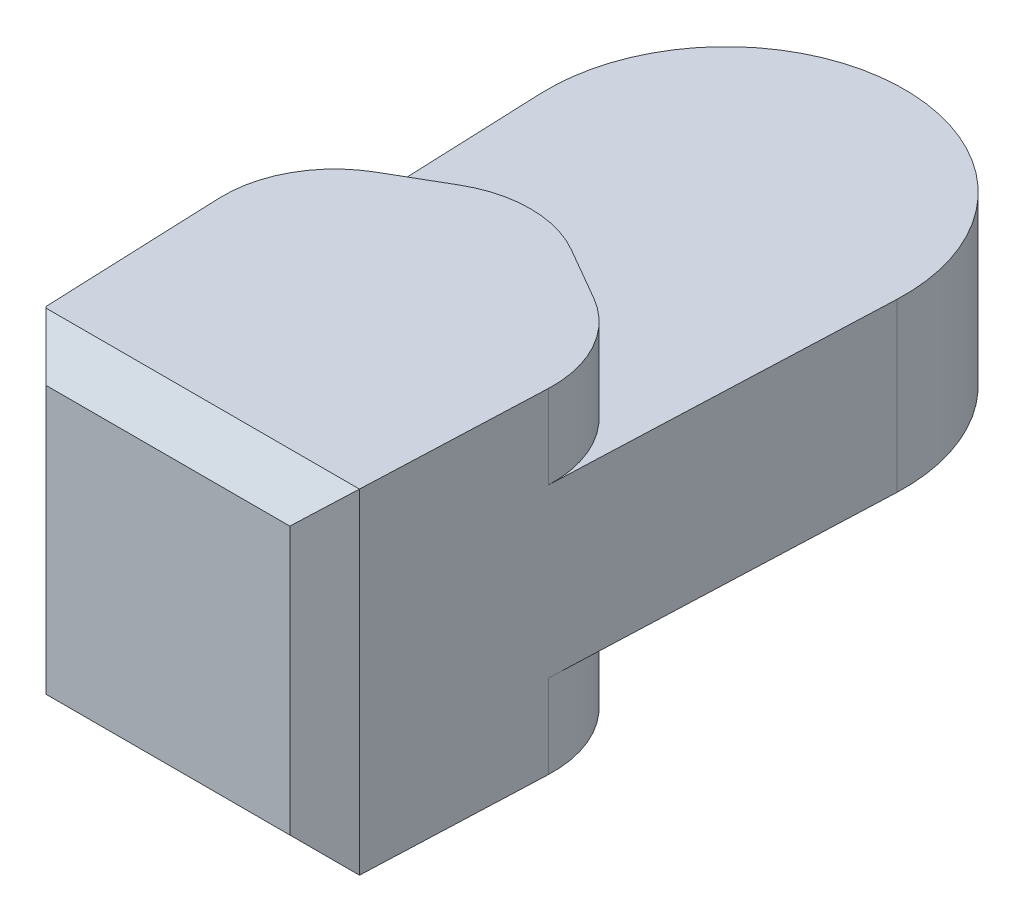
ISO-10303-21;
HEADER;
FILE_DESCRIPTION(('STEP AP214'),'2;1');
FILE_NAME('part.step','',(''),(''),'','','');
FILE_SCHEMA(('AUTOMOTIVE_DESIGN { 1 0 10303 214 1 1 1 1 }'));
ENDSEC;
DATA;
#1=APPLICATION_CONTEXT('core data for automotive mechanical design processes');
#2=APPLICATION_PROTOCOL_DEFINITION('international standard','automotive_design',2000,#1);
#3=PRODUCT_CONTEXT('',#1,'mechanical');
#4=PRODUCT('Part','Part','',(#3));
#5=PRODUCT_RELATED_PRODUCT_CATEGORY('part','',(#4));
#6=PRODUCT_DEFINITION_FORMATION('','',#4);
#7=PRODUCT_DEFINITION_CONTEXT('part definition',#1,'design');
#8=PRODUCT_DEFINITION('design','',#6,#7);
#9=PRODUCT_DEFINITION_SHAPE('','',#8);
#10=(LENGTH_UNIT() NAMED_UNIT(*) SI_UNIT(.MILLI.,.METRE.));
#11=(NAMED_UNIT(*) PLANE_ANGLE_UNIT() SI_UNIT($,.RADIAN.));
#12=(NAMED_UNIT(*) SI_UNIT($,.STERADIAN.) SOLID_ANGLE_UNIT());
#13=UNCERTAINTY_MEASURE_WITH_UNIT(LENGTH_MEASURE(1.E-05),#10,'distance_accuracy_value','');
#14=(GEOMETRIC_REPRESENTATION_CONTEXT(3) GLOBAL_UNCERTAINTY_ASSIGNED_CONTEXT((#13)) GLOBAL_UNIT_ASSIGNED_CONTEXT((#10,
#11,#12)) REPRESENTATION_CONTEXT('',''));
#15=CARTESIAN_POINT('',(0.,0.,0.));
#16=DIRECTION('',(0.,0.,1.));
#17=DIRECTION('',(1.,0.,0.));
#18=AXIS2_PLACEMENT_3D('',#15,#16,#17);
#19=CARTESIAN_POINT('',(0.,-1.5,-2.5));
#20=DIRECTION('',(0.,1.,0.));
#21=DIRECTION('',(0.,0.,1.));
#22=AXIS2_PLACEMENT_3D('',#19,#20,#21);
#23=CYLINDRICAL_SURFACE('',#22,1.6);
#24=DIRECTION('',(0.,1.,0.));
#25=VECTOR('',#24,1.);
#26=CARTESIAN_POINT('',(-1.59870492999744,-1.5,-2.43563738039928));
#27=LINE('',#26,#25);
#28=CARTESIAN_POINT('',(-1.59870492999744,-0.75,-2.43563738039928));
#29=VERTEX_POINT('',#28);
#30=CARTESIAN_POINT('',(-1.59870492999744,0.749999999999999,-2.43563738039928));
#31=VERTEX_POINT('',#30);
#32=EDGE_CURVE('E196',#29,#31,#27,.T.);
#33=ORIENTED_EDGE('',*,*,#32,.T.);
#34=CARTESIAN_POINT('',(0.,0.749999999999999,-2.5));
#35=DIRECTION('',(0.,1.,0.));
#36=DIRECTION('',(0.,0.,1.));
#37=AXIS2_PLACEMENT_3D('',#34,#35,#36);
#38=CIRCLE('',#37,1.6);
#39=CARTESIAN_POINT('',(1.59870492999744,0.749999999999999,-2.43563738039928));
#40=VERTEX_POINT('',#39);
#41=EDGE_CURVE('E180',#31,#40,#38,.F.);
#42=ORIENTED_EDGE('',*,*,#41,.T.);
#43=DIRECTION('',(0.,1.,0.));
#44=VECTOR('',#43,1.);
#45=CARTESIAN_POINT('',(1.59870492999744,-1.5,-2.43563738039928));
#46=LINE('',#45,#44);
#47=CARTESIAN_POINT('',(1.59870492999744,-0.75,-2.43563738039928));
#48=VERTEX_POINT('',#47);
#49=EDGE_CURVE('E205',#48,#40,#46,.T.);
#50=ORIENTED_EDGE('',*,*,#49,.F.);
#51=CARTESIAN_POINT('',(0.,-0.75,-2.5));
#52=DIRECTION('',(0.,1.,0.));
#53=DIRECTION('',(0.,0.,1.));
#54=AXIS2_PLACEMENT_3D('',#51,#52,#53);
#55=CIRCLE('',#54,1.6);
#56=EDGE_CURVE('E203',#29,#48,#55,.F.);
#57=ORIENTED_EDGE('',*,*,#56,.F.);
#58=EDGE_LOOP('',(#33,#42,#50,#57));
#59=FACE_BOUND('',#58,.T.);
#60=ADVANCED_FACE('F41',(#59),#23,.T.);
#61=CARTESIAN_POINT('',(1.49821973735759,-1.5,0.0603171637395179));
#62=DIRECTION('',(0.999190581248403,0.,0.0402266372504472));
#63=DIRECTION('',(0.0402266372504472,0.,-0.999190581248403));
#64=AXIS2_PLACEMENT_3D('',#61,#62,#63);
#65=PLANE('',#64);
#66=DIRECTION('',(0.,-1.,0.));
#67=VECTOR('',#66,1.);
#68=CARTESIAN_POINT('',(1.41206799117513,-1.5,2.20024282562548));
#69=LINE('',#68,#67);
#70=CARTESIAN_POINT('',(1.41206799117513,1.49975717437452,2.20024282562548));
#71=VERTEX_POINT('',#70);
#72=CARTESIAN_POINT('',(1.41206799117513,-1.49975717437452,2.20024282562548));
#73=VERTEX_POINT('',#72);
#74=EDGE_CURVE('E284',#71,#73,#69,.T.);
#75=ORIENTED_EDGE('',*,*,#74,.T.);
#76=DIRECTION('',(0.028456042079804,-0.706820434647002,-0.706820434647002));
#77=VECTOR('',#76,1.);
#78=CARTESIAN_POINT('',(1.45518362882412,-2.57070771829316,1.12929228170684));
#79=LINE('',#78,#77);
#80=CARTESIAN_POINT('',(1.41207776714634,-1.5,2.2));
#81=VERTEX_POINT('',#80);
#82=EDGE_CURVE('E287',#73,#81,#79,.T.);
#83=ORIENTED_EDGE('',*,*,#82,.T.);
#84=DIRECTION('',(0.0402266372504472,0.,-0.999190581248403));
#85=VECTOR('',#84,1.);
#86=CARTESIAN_POINT('',(1.49821973735759,-1.5,0.0603171637395179));
#87=LINE('',#86,#85);
#88=CARTESIAN_POINT('',(1.47765328930941,-1.5,0.571167748925916));
#89=VERTEX_POINT('',#88);
#90=EDGE_CURVE('E336',#81,#89,#87,.T.);
#91=ORIENTED_EDGE('',*,*,#90,.T.);
#92=DIRECTION('',(0.,-1.,0.));
#93=VECTOR('',#92,1.);
#94=CARTESIAN_POINT('',(1.47765328930941,-0.75,0.571167748925916));
#95=LINE('',#94,#93);
#96=CARTESIAN_POINT('',(1.47765328930941,-0.75,0.571167748925916));
#97=VERTEX_POINT('',#96);
#98=EDGE_CURVE('E231',#89,#97,#95,.F.);
#99=ORIENTED_EDGE('',*,*,#98,.T.);
#100=DIRECTION('',(-0.0402266372504472,0.,0.999190581248403));
#101=VECTOR('',#100,1.);
#102=CARTESIAN_POINT('',(1.49821973735759,-0.75,0.0603171637395179));
#103=LINE('',#102,#101);
#104=EDGE_CURVE('E331',#48,#97,#103,.T.);
#105=ORIENTED_EDGE('',*,*,#104,.F.);
#106=ORIENTED_EDGE('',*,*,#49,.T.);
#107=DIRECTION('',(-0.0402266372504472,0.,0.999190581248403));
#108=VECTOR('',#107,1.);
#109=CARTESIAN_POINT('',(1.49821973735759,0.749999999999999,0.0603171637395179));
#110=LINE('',#109,#108);
#111=CARTESIAN_POINT('',(1.47765328930941,0.749999999999999,0.571167748925916));
#112=VERTEX_POINT('',#111);
#113=EDGE_CURVE('E186',#40,#112,#110,.T.);
#114=ORIENTED_EDGE('',*,*,#113,.T.);
#115=DIRECTION('',(0.,-1.,0.));
#116=VECTOR('',#115,1.);
#117=CARTESIAN_POINT('',(1.47765328930941,1.5,0.571167748925916));
#118=LINE('',#117,#116);
#119=CARTESIAN_POINT('',(1.47765328930941,1.5,0.571167748925916));
#120=VERTEX_POINT('',#119);
#121=EDGE_CURVE('E228',#112,#120,#118,.F.);
#122=ORIENTED_EDGE('',*,*,#121,.T.);
#123=DIRECTION('',(0.0402266372504472,0.,-0.999190581248403));
#124=VECTOR('',#123,1.);
#125=CARTESIAN_POINT('',(1.49821973735759,1.5,0.0603171637395179));
#126=LINE('',#125,#124);
#127=CARTESIAN_POINT('',(1.41207776714634,1.5,2.2));
#128=VERTEX_POINT('',#127);
#129=EDGE_CURVE('E333',#128,#120,#126,.T.);
#130=ORIENTED_EDGE('',*,*,#129,.F.);
#131=DIRECTION('',(0.028456042079804,0.706820434647003,-0.706820434647001));
#132=VECTOR('',#131,1.);
#133=CARTESIAN_POINT('',(1.39484369273058,1.07192233778943,2.62807766221057));
#134=LINE('',#133,#132);
#135=EDGE_CURVE('E282',#128,#71,#134,.F.);
#136=ORIENTED_EDGE('',*,*,#135,.T.);
#137=EDGE_LOOP('',(#75,#83,#91,#99,#105,#106,#114,#122,#130,#136));
#138=FACE_BOUND('',#137,.T.);
#139=ADVANCED_FACE('F351',(#138),#65,.T.);
#140=CARTESIAN_POINT('',(0.,-1.5,2.5));
#141=DIRECTION('',(0.,0.,1.));
#142=DIRECTION('',(1.,0.,0.));
#143=AXIS2_PLACEMENT_3D('',#140,#141,#142);
#144=PLANE('',#143);
#145=DIRECTION('',(1.,0.,0.));
#146=VECTOR('',#145,1.);
#147=CARTESIAN_POINT('',(1.4,-1.2,2.5));
#148=LINE('',#147,#146);
#149=CARTESIAN_POINT('',(-1.1,-1.2,2.5));
#150=VERTEX_POINT('',#149);
#151=CARTESIAN_POINT('',(1.08716237781653,-1.2,2.5));
#152=VERTEX_POINT('',#151);
#153=EDGE_CURVE('E277',#150,#152,#148,.T.);
#154=ORIENTED_EDGE('',*,*,#153,.T.);
#155=DIRECTION('',(0.,1.,0.));
#156=VECTOR('',#155,1.);
#157=CARTESIAN_POINT('',(1.08716237781653,-1.5,2.5));
#158=LINE('',#157,#156);
#159=CARTESIAN_POINT('',(1.08716237781653,1.2,2.5));
#160=VERTEX_POINT('',#159);
#161=EDGE_CURVE('E279',#152,#160,#158,.T.);
#162=ORIENTED_EDGE('',*,*,#161,.T.);
#163=DIRECTION('',(-1.,0.,0.));
#164=VECTOR('',#163,1.);
#165=CARTESIAN_POINT('',(0.,1.2,2.5));
#166=LINE('',#165,#164);
#167=CARTESIAN_POINT('',(-1.1,1.2,2.5));
#168=VERTEX_POINT('',#167);
#169=EDGE_CURVE('E273',#160,#168,#166,.T.);
#170=ORIENTED_EDGE('',*,*,#169,.T.);
#171=DIRECTION('',(0.,-1.,0.));
#172=VECTOR('',#171,1.);
#173=CARTESIAN_POINT('',(-1.1,-1.5,2.5));
#174=LINE('',#173,#172);
#175=EDGE_CURVE('E275',#168,#150,#174,.T.);
#176=ORIENTED_EDGE('',*,*,#175,.T.);
#177=EDGE_LOOP('',(#154,#162,#170,#176));
#178=FACE_BOUND('',#177,.T.);
#179=ADVANCED_FACE('F385',(#178),#144,.T.);
#180=CARTESIAN_POINT('',(-1.49821973735759,-1.5,0.0603171637395179));
#181=DIRECTION('',(-0.999190581248403,0.,0.0402266372504472));
#182=DIRECTION('',(0.0402266372504472,0.,0.999190581248403));
#183=AXIS2_PLACEMENT_3D('',#180,#181,#182);
#184=PLANE('',#183);
#185=DIRECTION('',(0.0402266372504472,0.,0.999190581248403));
#186=VECTOR('',#185,1.);
#187=CARTESIAN_POINT('',(-1.49821973735759,-1.5,0.0603171637395179));
#188=LINE('',#187,#186);
#189=CARTESIAN_POINT('',(-1.47765328930941,-1.5,0.571167748925925));
#190=VERTEX_POINT('',#189);
#191=CARTESIAN_POINT('',(-1.41258440554587,-1.5,2.18741559445413));
#192=VERTEX_POINT('',#191);
#193=EDGE_CURVE('E209',#190,#192,#188,.T.);
#194=ORIENTED_EDGE('',*,*,#193,.T.);
#195=DIRECTION('',(0.,1.,0.));
#196=VECTOR('',#195,1.);
#197=CARTESIAN_POINT('',(-1.41258440554587,-1.5,2.18741559445413));
#198=LINE('',#197,#196);
#199=CARTESIAN_POINT('',(-1.41258440554587,1.5,2.18741559445413));
#200=VERTEX_POINT('',#199);
#201=EDGE_CURVE('E65',#192,#200,#198,.T.);
#202=ORIENTED_EDGE('',*,*,#201,.T.);
#203=DIRECTION('',(0.0402266372504472,0.,0.999190581248403));
#204=VECTOR('',#203,1.);
#205=CARTESIAN_POINT('',(-1.49821973735759,1.5,0.0603171637395179));
#206=LINE('',#205,#204);
#207=CARTESIAN_POINT('',(-1.47765328930941,1.5,0.571167748925925));
#208=VERTEX_POINT('',#207);
#209=EDGE_CURVE('E335',#208,#200,#206,.T.);
#210=ORIENTED_EDGE('',*,*,#209,.F.);
#211=DIRECTION('',(0.,1.,0.));
#212=VECTOR('',#211,1.);
#213=CARTESIAN_POINT('',(-1.47765328930941,0.75,0.571167748925925));
#214=LINE('',#213,#212);
#215=CARTESIAN_POINT('',(-1.47765328930941,0.749999999999999,0.571167748925926));
#216=VERTEX_POINT('',#215);
#217=EDGE_CURVE('E198',#208,#216,#214,.F.);
#218=ORIENTED_EDGE('',*,*,#217,.T.);
#219=DIRECTION('',(-0.0402266372504472,0.,-0.999190581248403));
#220=VECTOR('',#219,1.);
#221=CARTESIAN_POINT('',(-1.49821973735759,0.749999999999999,0.0603171637395179));
#222=LINE('',#221,#220);
#223=EDGE_CURVE('E183',#216,#31,#222,.T.);
#224=ORIENTED_EDGE('',*,*,#223,.T.);
#225=ORIENTED_EDGE('',*,*,#32,.F.);
#226=DIRECTION('',(-0.0402266372504472,0.,-0.999190581248403));
#227=VECTOR('',#226,1.);
#228=CARTESIAN_POINT('',(-1.49821973735759,-0.75,0.0603171637395179));
#229=LINE('',#228,#227);
#230=CARTESIAN_POINT('',(-1.47765328930941,-0.75,0.571167748925925));
#231=VERTEX_POINT('',#230);
#232=EDGE_CURVE('E327',#231,#29,#229,.T.);
#233=ORIENTED_EDGE('',*,*,#232,.F.);
#234=DIRECTION('',(0.,1.,0.));
#235=VECTOR('',#234,1.);
#236=CARTESIAN_POINT('',(-1.47765328930941,-1.5,0.571167748925925));
#237=LINE('',#236,#235);
#238=EDGE_CURVE('E253',#231,#190,#237,.F.);
#239=ORIENTED_EDGE('',*,*,#238,.T.);
#240=EDGE_LOOP('',(#194,#202,#210,#218,#224,#225,#233,#239));
#241=FACE_BOUND('',#240,.T.);
#242=ADVANCED_FACE('F195',(#241),#184,.T.);
#243=CARTESIAN_POINT('',(0.,-1.5,0.));
#244=DIRECTION('',(0.,1.,0.));
#245=DIRECTION('',(0.,0.,1.));
#246=AXIS2_PLACEMENT_3D('',#243,#244,#245);
#247=PLANE('',#246);
#248=ORIENTED_EDGE('',*,*,#90,.F.);
#249=DIRECTION('',(-1.,0.,0.));
#250=VECTOR('',#249,1.);
#251=CARTESIAN_POINT('',(-1.4,-1.5,2.2));
#252=LINE('',#251,#250);
#253=CARTESIAN_POINT('',(-1.4,-1.5,2.2));
#254=VERTEX_POINT('',#253);
#255=EDGE_CURVE('E291',#81,#254,#252,.T.);
#256=ORIENTED_EDGE('',*,*,#255,.T.);
#257=DIRECTION('',(0.707106781186549,0.,0.707106781186546));
#258=VECTOR('',#257,1.);
#259=CARTESIAN_POINT('',(-1.41258440554587,-1.5,2.18741559445413));
#260=LINE('',#259,#258);
#261=EDGE_CURVE('E289',#254,#192,#260,.F.);
#262=ORIENTED_EDGE('',*,*,#261,.T.);
#263=ORIENTED_EDGE('',*,*,#193,.F.);
#264=CARTESIAN_POINT('',(-0.478462708061008,-1.5,0.530941111675478));
#265=DIRECTION('',(0.,1.,0.));
#266=DIRECTION('',(0.,0.,1.));
#267=AXIS2_PLACEMENT_3D('',#264,#265,#266);
#268=CIRCLE('',#267,1.);
#269=CARTESIAN_POINT('',(-0.978462708061012,-1.5,-0.335084292108958));
#270=VERTEX_POINT('',#269);
#271=EDGE_CURVE('E223',#190,#270,#268,.F.);
#272=ORIENTED_EDGE('',*,*,#271,.T.);
#273=DIRECTION('',(-0.866025403784436,0.,0.500000000000004));
#274=VECTOR('',#273,1.);
#275=CARTESIAN_POINT('',(-3.14485600444001,-1.5,0.915683460726073));
#276=LINE('',#275,#274);
#277=CARTESIAN_POINT('',(-0.5,-1.5,-0.611324865405183));
#278=VERTEX_POINT('',#277);
#279=EDGE_CURVE('E320',#278,#270,#276,.T.);
#280=ORIENTED_EDGE('',*,*,#279,.F.);
#281=CARTESIAN_POINT('',(0.,-1.5,0.254700538379253));
#282=DIRECTION('',(0.,1.,0.));
#283=DIRECTION('',(0.,0.,1.));
#284=AXIS2_PLACEMENT_3D('',#281,#282,#283);
#285=CIRCLE('',#284,1.);
#286=CARTESIAN_POINT('',(0.500000000000002,-1.5,-0.611324865405187));
#287=VERTEX_POINT('',#286);
#288=EDGE_CURVE('E221',#278,#287,#285,.F.);
#289=ORIENTED_EDGE('',*,*,#288,.T.);
#290=DIRECTION('',(0.86602540378444,0.,0.499999999999998));
#291=VECTOR('',#290,1.);
#292=CARTESIAN_POINT('',(0.389711431702996,-1.5,-0.675000000000002));
#293=LINE('',#292,#291);
#294=CARTESIAN_POINT('',(0.978462708061006,-1.5,-0.335084292108971));
#295=VERTEX_POINT('',#294);
#296=EDGE_CURVE('E204',#287,#295,#293,.T.);
#297=ORIENTED_EDGE('',*,*,#296,.T.);
#298=CARTESIAN_POINT('',(0.478462708061008,-1.5,0.530941111675469));
#299=DIRECTION('',(0.,1.,0.));
#300=DIRECTION('',(0.,0.,1.));
#301=AXIS2_PLACEMENT_3D('',#298,#299,#300);
#302=CIRCLE('',#301,1.);
#303=EDGE_CURVE('E225',#295,#89,#302,.F.);
#304=ORIENTED_EDGE('',*,*,#303,.T.);
#305=EDGE_LOOP('',(#248,#256,#262,#263,#272,#280,#289,#297,#304));
#306=FACE_BOUND('',#305,.T.);
#307=ADVANCED_FACE('F430',(#306),#247,.F.);
#308=CARTESIAN_POINT('',(0.,1.5,0.));
#309=DIRECTION('',(0.,1.,0.));
#310=DIRECTION('',(0.,0.,1.));
#311=AXIS2_PLACEMENT_3D('',#308,#309,#310);
#312=PLANE('',#311);
#313=ORIENTED_EDGE('',*,*,#209,.T.);
#314=DIRECTION('',(-0.707106781186549,0.,-0.707106781186546));
#315=VECTOR('',#314,1.);
#316=CARTESIAN_POINT('',(-1.8,1.5,1.8));
#317=LINE('',#316,#315);
#318=CARTESIAN_POINT('',(-1.4,1.5,2.2));
#319=VERTEX_POINT('',#318);
#320=EDGE_CURVE('E11',#200,#319,#317,.F.);
#321=ORIENTED_EDGE('',*,*,#320,.T.);
#322=DIRECTION('',(1.,0.,0.));
#323=VECTOR('',#322,1.);
#324=CARTESIAN_POINT('',(0.,1.5,2.2));
#325=LINE('',#324,#323);
#326=EDGE_CURVE('E51',#319,#128,#325,.T.);
#327=ORIENTED_EDGE('',*,*,#326,.T.);
#328=ORIENTED_EDGE('',*,*,#129,.T.);
#329=CARTESIAN_POINT('',(0.478462708061008,1.5,0.530941111675469));
#330=DIRECTION('',(0.,1.,0.));
#331=DIRECTION('',(0.,0.,1.));
#332=AXIS2_PLACEMENT_3D('',#329,#330,#331);
#333=CIRCLE('',#332,1.);
#334=CARTESIAN_POINT('',(0.978462708061007,1.5,-0.335084292108971));
#335=VERTEX_POINT('',#334);
#336=EDGE_CURVE('E244',#120,#335,#333,.T.);
#337=ORIENTED_EDGE('',*,*,#336,.T.);
#338=DIRECTION('',(0.86602540378444,0.,0.499999999999998));
#339=VECTOR('',#338,1.);
#340=CARTESIAN_POINT('',(0.,1.5,-0.9));
#341=LINE('',#340,#339);
#342=CARTESIAN_POINT('',(0.500000000000002,1.5,-0.611324865405187));
#343=VERTEX_POINT('',#342);
#344=EDGE_CURVE('E304',#343,#335,#341,.T.);
#345=ORIENTED_EDGE('',*,*,#344,.F.);
#346=CARTESIAN_POINT('',(0.,1.5,0.254700538379252));
#347=DIRECTION('',(0.,1.,0.));
#348=DIRECTION('',(0.,0.,1.));
#349=AXIS2_PLACEMENT_3D('',#346,#347,#348);
#350=CIRCLE('',#349,1.);
#351=CARTESIAN_POINT('',(-0.5,1.5,-0.611324865405184));
#352=VERTEX_POINT('',#351);
#353=EDGE_CURVE('E240',#343,#352,#350,.T.);
#354=ORIENTED_EDGE('',*,*,#353,.T.);
#355=DIRECTION('',(0.866025403784436,0.,-0.500000000000004));
#356=VECTOR('',#355,1.);
#357=CARTESIAN_POINT('',(-0.389711431702999,1.5,-0.674999999999996));
#358=LINE('',#357,#356);
#359=CARTESIAN_POINT('',(-0.978462708061012,1.5,-0.335084292108958));
#360=VERTEX_POINT('',#359);
#361=EDGE_CURVE('E192',#360,#352,#358,.T.);
#362=ORIENTED_EDGE('',*,*,#361,.F.);
#363=CARTESIAN_POINT('',(-0.478462708061008,1.5,0.530941111675478));
#364=DIRECTION('',(0.,1.,0.));
#365=DIRECTION('',(0.,0.,1.));
#366=AXIS2_PLACEMENT_3D('',#363,#364,#365);
#367=CIRCLE('',#366,1.);
#368=EDGE_CURVE('E242',#360,#208,#367,.T.);
#369=ORIENTED_EDGE('',*,*,#368,.T.);
#370=EDGE_LOOP('',(#313,#321,#327,#328,#337,#345,#354,#362,#369));
#371=FACE_BOUND('',#370,.T.);
#372=ADVANCED_FACE('F350',(#371),#312,.T.);
#373=CARTESIAN_POINT('',(-3.14485600444001,-0.75,0.915683460726073));
#374=DIRECTION('',(0.500000000000004,0.,0.866025403784436));
#375=DIRECTION('',(0.866025403784436,0.,-0.500000000000004));
#376=AXIS2_PLACEMENT_3D('',#373,#374,#375);
#377=PLANE('',#376);
#378=ORIENTED_EDGE('',*,*,#279,.T.);
#379=DIRECTION('',(0.,1.,0.));
#380=VECTOR('',#379,1.);
#381=CARTESIAN_POINT('',(-0.978462708061012,-0.75,-0.335084292108958));
#382=LINE('',#381,#380);
#383=CARTESIAN_POINT('',(-0.978462708061012,-0.75,-0.335084292108958));
#384=VERTEX_POINT('',#383);
#385=EDGE_CURVE('E249',#270,#384,#382,.T.);
#386=ORIENTED_EDGE('',*,*,#385,.T.);
#387=DIRECTION('',(-0.866025403784436,0.,0.500000000000004));
#388=VECTOR('',#387,1.);
#389=CARTESIAN_POINT('',(-3.14485600444001,-0.75,0.915683460726073));
#390=LINE('',#389,#388);
#391=CARTESIAN_POINT('',(-0.5,-0.75,-0.611324865405183));
#392=VERTEX_POINT('',#391);
#393=EDGE_CURVE('E321',#392,#384,#390,.T.);
#394=ORIENTED_EDGE('',*,*,#393,.F.);
#395=DIRECTION('',(0.,-1.,0.));
#396=VECTOR('',#395,1.);
#397=CARTESIAN_POINT('',(-0.5,-0.75,-0.611324865405184));
#398=LINE('',#397,#396);
#399=EDGE_CURVE('E246',#392,#278,#398,.T.);
#400=ORIENTED_EDGE('',*,*,#399,.T.);
#401=EDGE_LOOP('',(#378,#386,#394,#400));
#402=FACE_BOUND('',#401,.T.);
#403=ADVANCED_FACE('F442',(#402),#377,.F.);
#404=CARTESIAN_POINT('',(0.,-0.75,-0.9));
#405=DIRECTION('',(-0.499999999999998,0.,0.86602540378444));
#406=DIRECTION('',(0.86602540378444,0.,0.499999999999998));
#407=AXIS2_PLACEMENT_3D('',#404,#405,#406);
#408=PLANE('',#407);
#409=DIRECTION('',(-0.86602540378444,0.,-0.499999999999998));
#410=VECTOR('',#409,1.);
#411=CARTESIAN_POINT('',(0.,-0.75,-0.9));
#412=LINE('',#411,#410);
#413=CARTESIAN_POINT('',(0.978462708061007,-0.75,-0.335084292108971));
#414=VERTEX_POINT('',#413);
#415=CARTESIAN_POINT('',(0.500000000000002,-0.75,-0.611324865405187));
#416=VERTEX_POINT('',#415);
#417=EDGE_CURVE('E324',#414,#416,#412,.T.);
#418=ORIENTED_EDGE('',*,*,#417,.F.);
#419=DIRECTION('',(0.,-1.,0.));
#420=VECTOR('',#419,1.);
#421=CARTESIAN_POINT('',(0.978462708061006,-1.5,-0.335084292108971));
#422=LINE('',#421,#420);
#423=EDGE_CURVE('E218',#414,#295,#422,.T.);
#424=ORIENTED_EDGE('',*,*,#423,.T.);
#425=ORIENTED_EDGE('',*,*,#296,.F.);
#426=DIRECTION('',(0.,-1.,0.));
#427=VECTOR('',#426,1.);
#428=CARTESIAN_POINT('',(0.500000000000002,-0.75,-0.611324865405187));
#429=LINE('',#428,#427);
#430=EDGE_CURVE('E191',#287,#416,#429,.F.);
#431=ORIENTED_EDGE('',*,*,#430,.T.);
#432=EDGE_LOOP('',(#418,#424,#425,#431));
#433=FACE_BOUND('',#432,.T.);
#434=ADVANCED_FACE('F447',(#433),#408,.F.);
#435=CARTESIAN_POINT('',(0.,-0.75,0.));
#436=DIRECTION('',(0.,1.,0.));
#437=DIRECTION('',(0.,0.,1.));
#438=AXIS2_PLACEMENT_3D('',#435,#436,#437);
#439=PLANE('',#438);
#440=ORIENTED_EDGE('',*,*,#104,.T.);
#441=CARTESIAN_POINT('',(0.478462708061008,-0.75,0.530941111675469));
#442=DIRECTION('',(0.,1.,0.));
#443=DIRECTION('',(0.,0.,1.));
#444=AXIS2_PLACEMENT_3D('',#441,#442,#443);
#445=CIRCLE('',#444,1.);
#446=EDGE_CURVE('E260',#97,#414,#445,.T.);
#447=ORIENTED_EDGE('',*,*,#446,.T.);
#448=ORIENTED_EDGE('',*,*,#417,.T.);
#449=CARTESIAN_POINT('',(0.,-0.75,0.254700538379253));
#450=DIRECTION('',(0.,1.,0.));
#451=DIRECTION('',(0.,0.,1.));
#452=AXIS2_PLACEMENT_3D('',#449,#450,#451);
#453=CIRCLE('',#452,1.);
#454=EDGE_CURVE('E269',#416,#392,#453,.T.);
#455=ORIENTED_EDGE('',*,*,#454,.T.);
#456=ORIENTED_EDGE('',*,*,#393,.T.);
#457=CARTESIAN_POINT('',(-0.478462708061008,-0.75,0.530941111675478));
#458=DIRECTION('',(0.,1.,0.));
#459=DIRECTION('',(0.,0.,1.));
#460=AXIS2_PLACEMENT_3D('',#457,#458,#459);
#461=CIRCLE('',#460,1.);
#462=EDGE_CURVE('E264',#384,#231,#461,.T.);
#463=ORIENTED_EDGE('',*,*,#462,.T.);
#464=ORIENTED_EDGE('',*,*,#232,.T.);
#465=ORIENTED_EDGE('',*,*,#56,.T.);
#466=EDGE_LOOP('',(#440,#447,#448,#455,#456,#463,#464,#465));
#467=FACE_BOUND('',#466,.T.);
#468=ADVANCED_FACE('F378',(#467),#439,.F.);
#469=CARTESIAN_POINT('',(-3.14485600444001,0.75,0.915683460726073));
#470=DIRECTION('',(0.500000000000004,0.,0.866025403784436));
#471=DIRECTION('',(0.866025403784436,0.,-0.500000000000004));
#472=AXIS2_PLACEMENT_3D('',#469,#470,#471);
#473=PLANE('',#472);
#474=DIRECTION('',(0.866025403784436,0.,-0.500000000000004));
#475=VECTOR('',#474,1.);
#476=CARTESIAN_POINT('',(-3.14485600444001,0.75,0.915683460726073));
#477=LINE('',#476,#475);
#478=CARTESIAN_POINT('',(-0.978462708061012,0.75,-0.335084292108958));
#479=VERTEX_POINT('',#478);
#480=CARTESIAN_POINT('',(-0.5,0.75,-0.611324865405183));
#481=VERTEX_POINT('',#480);
#482=EDGE_CURVE('E310',#479,#481,#477,.T.);
#483=ORIENTED_EDGE('',*,*,#482,.F.);
#484=DIRECTION('',(0.,1.,0.));
#485=VECTOR('',#484,1.);
#486=CARTESIAN_POINT('',(-0.978462708061012,1.5,-0.335084292108958));
#487=LINE('',#486,#485);
#488=EDGE_CURVE('E257',#479,#360,#487,.T.);
#489=ORIENTED_EDGE('',*,*,#488,.T.);
#490=ORIENTED_EDGE('',*,*,#361,.T.);
#491=DIRECTION('',(0.,1.,0.));
#492=VECTOR('',#491,1.);
#493=CARTESIAN_POINT('',(-0.5,0.75,-0.611324865405184));
#494=LINE('',#493,#492);
#495=EDGE_CURVE('E255',#352,#481,#494,.F.);
#496=ORIENTED_EDGE('',*,*,#495,.T.);
#497=EDGE_LOOP('',(#483,#489,#490,#496));
#498=FACE_BOUND('',#497,.T.);
#499=ADVANCED_FACE('F363',(#498),#473,.F.);
#500=CARTESIAN_POINT('',(0.,0.75,-0.9));
#501=DIRECTION('',(-0.499999999999998,0.,0.86602540378444));
#502=DIRECTION('',(0.86602540378444,0.,0.499999999999998));
#503=AXIS2_PLACEMENT_3D('',#500,#501,#502);
#504=PLANE('',#503);
#505=ORIENTED_EDGE('',*,*,#344,.T.);
#506=DIRECTION('',(0.,-1.,0.));
#507=VECTOR('',#506,1.);
#508=CARTESIAN_POINT('',(0.978462708061006,0.75,-0.335084292108971));
#509=LINE('',#508,#507);
#510=CARTESIAN_POINT('',(0.978462708061007,0.75,-0.335084292108971));
#511=VERTEX_POINT('',#510);
#512=EDGE_CURVE('E237',#335,#511,#509,.T.);
#513=ORIENTED_EDGE('',*,*,#512,.T.);
#514=DIRECTION('',(0.86602540378444,0.,0.499999999999998));
#515=VECTOR('',#514,1.);
#516=CARTESIAN_POINT('',(0.,0.75,-0.9));
#517=LINE('',#516,#515);
#518=CARTESIAN_POINT('',(0.500000000000002,0.75,-0.611324865405187));
#519=VERTEX_POINT('',#518);
#520=EDGE_CURVE('E200',#519,#511,#517,.T.);
#521=ORIENTED_EDGE('',*,*,#520,.F.);
#522=DIRECTION('',(0.,1.,0.));
#523=VECTOR('',#522,1.);
#524=CARTESIAN_POINT('',(0.500000000000002,0.75,-0.611324865405187));
#525=LINE('',#524,#523);
#526=EDGE_CURVE('E234',#519,#343,#525,.T.);
#527=ORIENTED_EDGE('',*,*,#526,.T.);
#528=EDGE_LOOP('',(#505,#513,#521,#527));
#529=FACE_BOUND('',#528,.T.);
#530=ADVANCED_FACE('F369',(#529),#504,.F.);
#531=CARTESIAN_POINT('',(0.,0.75,0.));
#532=DIRECTION('',(0.,1.,0.));
#533=DIRECTION('',(0.,0.,1.));
#534=AXIS2_PLACEMENT_3D('',#531,#532,#533);
#535=PLANE('',#534);
#536=ORIENTED_EDGE('',*,*,#41,.F.);
#537=ORIENTED_EDGE('',*,*,#223,.F.);
#538=CARTESIAN_POINT('',(-0.478462708061008,0.75,0.530941111675478));
#539=DIRECTION('',(0.,1.,0.));
#540=DIRECTION('',(0.,0.,1.));
#541=AXIS2_PLACEMENT_3D('',#538,#539,#540);
#542=CIRCLE('',#541,1.);
#543=EDGE_CURVE('E267',#216,#479,#542,.F.);
#544=ORIENTED_EDGE('',*,*,#543,.T.);
#545=ORIENTED_EDGE('',*,*,#482,.T.);
#546=CARTESIAN_POINT('',(0.,0.75,0.254700538379252));
#547=DIRECTION('',(0.,1.,0.));
#548=DIRECTION('',(0.,0.,1.));
#549=AXIS2_PLACEMENT_3D('',#546,#547,#548);
#550=CIRCLE('',#549,1.);
#551=EDGE_CURVE('E271',#481,#519,#550,.F.);
#552=ORIENTED_EDGE('',*,*,#551,.T.);
#553=ORIENTED_EDGE('',*,*,#520,.T.);
#554=CARTESIAN_POINT('',(0.478462708061008,0.75,0.530941111675469));
#555=DIRECTION('',(0.,1.,0.));
#556=DIRECTION('',(0.,0.,1.));
#557=AXIS2_PLACEMENT_3D('',#554,#555,#556);
#558=CIRCLE('',#557,1.);
#559=EDGE_CURVE('E262',#511,#112,#558,.F.);
#560=ORIENTED_EDGE('',*,*,#559,.T.);
#561=ORIENTED_EDGE('',*,*,#113,.F.);
#562=EDGE_LOOP('',(#536,#537,#544,#545,#552,#553,#560,#561));
#563=FACE_BOUND('',#562,.T.);
#564=ADVANCED_FACE('F182',(#563),#535,.T.);
#565=CARTESIAN_POINT('',(0.478462708061008,-0.75,0.530941111675469));
#566=DIRECTION('',(0.,1.,0.));
#567=DIRECTION('',(0.,0.,1.));
#568=AXIS2_PLACEMENT_3D('',#565,#566,#567);
#569=CYLINDRICAL_SURFACE('',#568,1.);
#570=ORIENTED_EDGE('',*,*,#446,.F.);
#571=ORIENTED_EDGE('',*,*,#98,.F.);
#572=ORIENTED_EDGE('',*,*,#303,.F.);
#573=ORIENTED_EDGE('',*,*,#423,.F.);
#574=EDGE_LOOP('',(#570,#571,#572,#573));
#575=FACE_BOUND('',#574,.T.);
#576=ADVANCED_FACE('F376',(#575),#569,.T.);
#577=CARTESIAN_POINT('',(0.478462708061008,0.75,0.530941111675469));
#578=DIRECTION('',(0.,1.,0.));
#579=DIRECTION('',(0.,0.,1.));
#580=AXIS2_PLACEMENT_3D('',#577,#578,#579);
#581=CYLINDRICAL_SURFACE('',#580,1.);
#582=ORIENTED_EDGE('',*,*,#336,.F.);
#583=ORIENTED_EDGE('',*,*,#121,.F.);
#584=ORIENTED_EDGE('',*,*,#559,.F.);
#585=ORIENTED_EDGE('',*,*,#512,.F.);
#586=EDGE_LOOP('',(#582,#583,#584,#585));
#587=FACE_BOUND('',#586,.T.);
#588=ADVANCED_FACE('F356',(#587),#581,.T.);
#589=CARTESIAN_POINT('',(-0.478462708061008,-0.75,0.530941111675478));
#590=DIRECTION('',(0.,-1.,0.));
#591=DIRECTION('',(0.,0.,-1.));
#592=AXIS2_PLACEMENT_3D('',#589,#590,#591);
#593=CYLINDRICAL_SURFACE('',#592,1.);
#594=ORIENTED_EDGE('',*,*,#271,.F.);
#595=ORIENTED_EDGE('',*,*,#238,.F.);
#596=ORIENTED_EDGE('',*,*,#462,.F.);
#597=ORIENTED_EDGE('',*,*,#385,.F.);
#598=EDGE_LOOP('',(#594,#595,#596,#597));
#599=FACE_BOUND('',#598,.T.);
#600=ADVANCED_FACE('F395',(#599),#593,.T.);
#601=CARTESIAN_POINT('',(-0.478462708061008,0.75,0.530941111675478));
#602=DIRECTION('',(0.,-1.,0.));
#603=DIRECTION('',(0.,0.,-1.));
#604=AXIS2_PLACEMENT_3D('',#601,#602,#603);
#605=CYLINDRICAL_SURFACE('',#604,1.);
#606=ORIENTED_EDGE('',*,*,#543,.F.);
#607=ORIENTED_EDGE('',*,*,#217,.F.);
#608=ORIENTED_EDGE('',*,*,#368,.F.);
#609=ORIENTED_EDGE('',*,*,#488,.F.);
#610=EDGE_LOOP('',(#606,#607,#608,#609));
#611=FACE_BOUND('',#610,.T.);
#612=ADVANCED_FACE('F398',(#611),#605,.T.);
#613=CARTESIAN_POINT('',(0.,-0.75,0.254700538379253));
#614=DIRECTION('',(0.,-1.,0.));
#615=DIRECTION('',(0.,0.,-1.));
#616=AXIS2_PLACEMENT_3D('',#613,#614,#615);
#617=CYLINDRICAL_SURFACE('',#616,1.);
#618=ORIENTED_EDGE('',*,*,#454,.F.);
#619=ORIENTED_EDGE('',*,*,#430,.F.);
#620=ORIENTED_EDGE('',*,*,#288,.F.);
#621=ORIENTED_EDGE('',*,*,#399,.F.);
#622=EDGE_LOOP('',(#618,#619,#620,#621));
#623=FACE_BOUND('',#622,.T.);
#624=ADVANCED_FACE('F402',(#623),#617,.T.);
#625=CARTESIAN_POINT('',(0.,0.75,0.254700538379252));
#626=DIRECTION('',(0.,1.,0.));
#627=DIRECTION('',(0.,0.,1.));
#628=AXIS2_PLACEMENT_3D('',#625,#626,#627);
#629=CYLINDRICAL_SURFACE('',#628,1.);
#630=ORIENTED_EDGE('',*,*,#551,.F.);
#631=ORIENTED_EDGE('',*,*,#495,.F.);
#632=ORIENTED_EDGE('',*,*,#353,.F.);
#633=ORIENTED_EDGE('',*,*,#526,.F.);
#634=EDGE_LOOP('',(#630,#631,#632,#633));
#635=FACE_BOUND('',#634,.T.);
#636=ADVANCED_FACE('F366',(#635),#629,.T.);
#637=CARTESIAN_POINT('',(-1.41258440554587,-1.5,2.18741559445413));
#638=DIRECTION('',(0.707106781186546,0.,-0.707106781186549));
#639=DIRECTION('',(0.,1.,0.));
#640=AXIS2_PLACEMENT_3D('',#637,#638,#639);
#641=PLANE('',#640);
#642=ORIENTED_EDGE('',*,*,#201,.F.);
#643=ORIENTED_EDGE('',*,*,#261,.F.);
#644=DIRECTION('',(-0.577350269189627,-0.577350269189625,-0.577350269189625));
#645=VECTOR('',#644,1.);
#646=CARTESIAN_POINT('',(-1.40838960369725,-1.50838960369724,2.19161039630276));
#647=LINE('',#646,#645);
#648=EDGE_CURVE('E46',#150,#254,#647,.T.);
#649=ORIENTED_EDGE('',*,*,#648,.F.);
#650=ORIENTED_EDGE('',*,*,#175,.F.);
#651=DIRECTION('',(0.577350269189627,-0.577350269189626,0.577350269189625));
#652=VECTOR('',#651,1.);
#653=CARTESIAN_POINT('',(-0.933333333333332,1.03333333333333,2.66666666666667));
#654=LINE('',#653,#652);
#655=EDGE_CURVE('E298',#319,#168,#654,.T.);
#656=ORIENTED_EDGE('',*,*,#655,.F.);
#657=ORIENTED_EDGE('',*,*,#320,.F.);
#658=EDGE_LOOP('',(#642,#643,#649,#650,#656,#657));
#659=FACE_BOUND('',#658,.T.);
#660=ADVANCED_FACE('F44',(#659),#641,.F.);
#661=CARTESIAN_POINT('',(0.,-1.2,2.5));
#662=DIRECTION('',(0.,-0.707106781186548,0.707106781186548));
#663=DIRECTION('',(-1.,0.,0.));
#664=AXIS2_PLACEMENT_3D('',#661,#662,#663);
#665=PLANE('',#664);
#666=ORIENTED_EDGE('',*,*,#255,.F.);
#667=ORIENTED_EDGE('',*,*,#82,.F.);
#668=DIRECTION('',(0.608313351078175,-0.561228503775441,-0.561228503775441));
#669=VECTOR('',#668,1.);
#670=CARTESIAN_POINT('',(0.684863231016146,-0.828839729016727,2.87116027098327));
#671=LINE('',#670,#669);
#672=EDGE_CURVE('E297',#152,#73,#671,.T.);
#673=ORIENTED_EDGE('',*,*,#672,.F.);
#674=ORIENTED_EDGE('',*,*,#153,.F.);
#675=ORIENTED_EDGE('',*,*,#648,.T.);
#676=EDGE_LOOP('',(#666,#667,#673,#674,#675));
#677=FACE_BOUND('',#676,.T.);
#678=ADVANCED_FACE('F421',(#677),#665,.T.);
#679=CARTESIAN_POINT('',(0.,1.5,2.2));
#680=DIRECTION('',(0.,-0.707106781186547,-0.707106781186549));
#681=DIRECTION('',(1.,0.,0.));
#682=AXIS2_PLACEMENT_3D('',#679,#680,#681);
#683=PLANE('',#682);
#684=ORIENTED_EDGE('',*,*,#655,.T.);
#685=ORIENTED_EDGE('',*,*,#169,.F.);
#686=DIRECTION('',(0.608313351078174,0.561228503775443,-0.561228503775441));
#687=VECTOR('',#686,1.);
#688=CARTESIAN_POINT('',(0.889704906127484,1.01782618908674,2.68217381091326));
#689=LINE('',#688,#687);
#690=EDGE_CURVE('E295',#71,#160,#689,.F.);
#691=ORIENTED_EDGE('',*,*,#690,.F.);
#692=ORIENTED_EDGE('',*,*,#135,.F.);
#693=ORIENTED_EDGE('',*,*,#326,.F.);
#694=EDGE_LOOP('',(#684,#685,#691,#692,#693));
#695=FACE_BOUND('',#694,.T.);
#696=ADVANCED_FACE('F347',(#695),#683,.F.);
#697=CARTESIAN_POINT('',(1.08716237781653,-1.5,2.5));
#698=DIRECTION('',(-0.678089907714352,0.,-0.734978963682595));
#699=DIRECTION('',(0.,1.,0.));
#700=AXIS2_PLACEMENT_3D('',#697,#698,#699);
#701=PLANE('',#700);
#702=ORIENTED_EDGE('',*,*,#672,.T.);
#703=ORIENTED_EDGE('',*,*,#74,.F.);
#704=ORIENTED_EDGE('',*,*,#690,.T.);
#705=ORIENTED_EDGE('',*,*,#161,.F.);
#706=EDGE_LOOP('',(#702,#703,#704,#705));
#707=FACE_BOUND('',#706,.T.);
#708=ADVANCED_FACE('F410',(#707),#701,.F.);
#709=CLOSED_SHELL('',(#60,#139,#179,#242,#307,#372,#403,#434,#468,#499,#530,#564,#576,#588,#600,
#612,#624,#636,#660,#678,#696,#708));
#710=MANIFOLD_SOLID_BREP('B2',#709);
#711=ADVANCED_BREP_SHAPE_REPRESENTATION('',(#18,#710),#14);
#712=SHAPE_DEFINITION_REPRESENTATION(#9,#711);
ENDSEC;
END-ISO-10303-21;
